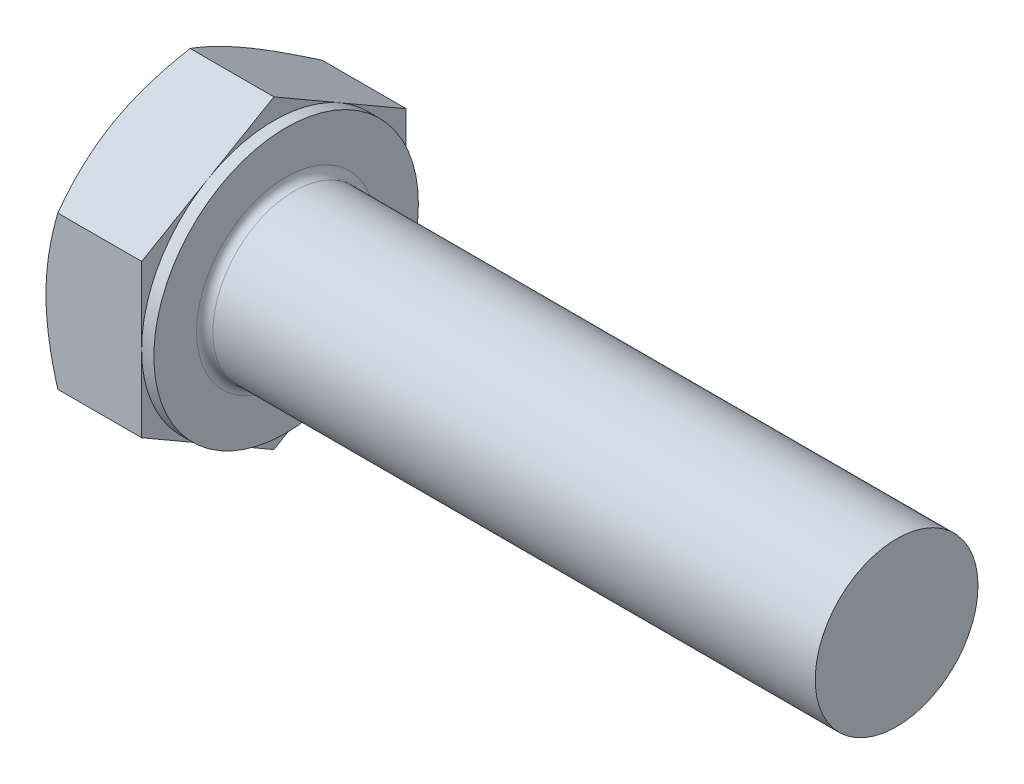
ISO-10303-21;
HEADER;
FILE_DESCRIPTION(('STEP AP214'),'2;1');
FILE_NAME('part.step','',(''),(''),'','','');
FILE_SCHEMA(('AUTOMOTIVE_DESIGN { 1 0 10303 214 1 1 1 1 }'));
ENDSEC;
DATA;
#1=APPLICATION_CONTEXT('core data for automotive mechanical design processes');
#2=APPLICATION_PROTOCOL_DEFINITION('international standard','automotive_design',2000,#1);
#3=PRODUCT_CONTEXT('',#1,'mechanical');
#4=PRODUCT('Part','Part','',(#3));
#5=PRODUCT_RELATED_PRODUCT_CATEGORY('part','',(#4));
#6=PRODUCT_DEFINITION_FORMATION('','',#4);
#7=PRODUCT_DEFINITION_CONTEXT('part definition',#1,'design');
#8=PRODUCT_DEFINITION('design','',#6,#7);
#9=PRODUCT_DEFINITION_SHAPE('','',#8);
#10=(LENGTH_UNIT() NAMED_UNIT(*) SI_UNIT(.MILLI.,.METRE.));
#11=(NAMED_UNIT(*) PLANE_ANGLE_UNIT() SI_UNIT($,.RADIAN.));
#12=(NAMED_UNIT(*) SI_UNIT($,.STERADIAN.) SOLID_ANGLE_UNIT());
#13=UNCERTAINTY_MEASURE_WITH_UNIT(LENGTH_MEASURE(1.E-05),#10,'distance_accuracy_value','');
#14=(GEOMETRIC_REPRESENTATION_CONTEXT(3) GLOBAL_UNCERTAINTY_ASSIGNED_CONTEXT((#13)) GLOBAL_UNIT_ASSIGNED_CONTEXT((#10,
#11,#12)) REPRESENTATION_CONTEXT('',''));
#15=CARTESIAN_POINT('',(0.,0.,0.));
#16=DIRECTION('',(0.,0.,1.));
#17=DIRECTION('',(1.,0.,0.));
#18=AXIS2_PLACEMENT_3D('',#15,#16,#17);
#19=CARTESIAN_POINT('',(0.,0.,0.));
#20=DIRECTION('',(-1.,0.,0.));
#21=DIRECTION('',(0.,0.,1.));
#22=AXIS2_PLACEMENT_3D('',#19,#20,#21);
#23=CYLINDRICAL_SURFACE('',#22,4.);
#24=CARTESIAN_POINT('',(5.7,0.,0.));
#25=DIRECTION('',(1.,0.,0.));
#26=DIRECTION('',(0.,0.,-1.));
#27=AXIS2_PLACEMENT_3D('',#24,#25,#26);
#28=CIRCLE('',#27,4.);
#29=CARTESIAN_POINT('',(5.7,0.,-4.));
#30=VERTEX_POINT('',#29);
#31=EDGE_CURVE('E12',#30,#30,#28,.T.);
#32=ORIENTED_EDGE('',*,*,#31,.T.);
#33=EDGE_LOOP('',(#32));
#34=FACE_BOUND('',#33,.T.);
#35=CARTESIAN_POINT('',(35.3,0.,0.));
#36=DIRECTION('',(1.,0.,0.));
#37=DIRECTION('',(0.,0.,-1.));
#38=AXIS2_PLACEMENT_3D('',#35,#36,#37);
#39=CIRCLE('',#38,4.);
#40=CARTESIAN_POINT('',(35.3,0.,-4.));
#41=VERTEX_POINT('',#40);
#42=EDGE_CURVE('E46',#41,#41,#39,.T.);
#43=ORIENTED_EDGE('',*,*,#42,.F.);
#44=EDGE_LOOP('',(#43));
#45=FACE_BOUND('',#44,.T.);
#46=ADVANCED_FACE('F42',(#34,#45),#23,.T.);
#47=CARTESIAN_POINT('',(5.3,3.75277674973256,-6.5));
#48=DIRECTION('',(0.,-0.866025403784438,0.500000000000001));
#49=DIRECTION('',(0.,-0.500000000000001,-0.866025403784438));
#50=AXIS2_PLACEMENT_3D('',#47,#48,#49);
#51=PLANE('',#50);
#52=DIRECTION('',(0.,0.500000000000001,0.866025403784438));
#53=VECTOR('',#52,1.);
#54=CARTESIAN_POINT('',(4.7,3.75277674973256,-6.5));
#55=LINE('',#54,#53);
#56=CARTESIAN_POINT('',(4.7,3.75277674973256,-6.5));
#57=VERTEX_POINT('',#56);
#58=CARTESIAN_POINT('',(4.7,5.62916512459885,-3.25000000000001));
#59=VERTEX_POINT('',#58);
#60=EDGE_CURVE('E175',#57,#59,#55,.T.);
#61=ORIENTED_EDGE('',*,*,#60,.F.);
#62=DIRECTION('',(-1.,0.,0.));
#63=VECTOR('',#62,1.);
#64=CARTESIAN_POINT('',(5.3,3.75277674973256,-6.5));
#65=LINE('',#64,#63);
#66=CARTESIAN_POINT('',(0.580556583600761,3.75277674973256,-6.5));
#67=VERTEX_POINT('',#66);
#68=EDGE_CURVE('E263',#57,#67,#65,.T.);
#69=ORIENTED_EDGE('',*,*,#68,.T.);
#70=CARTESIAN_POINT('',(0.580623251805869,7.50566896951898,0.000200000000000029));
#71=CARTESIAN_POINT('',(0.533004423075488,7.4231786300702,-0.14267745905888));
#72=CARTESIAN_POINT('',(0.487546700602709,7.34038072665458,-0.286087634534912));
#73=CARTESIAN_POINT('',(0.401548682023048,7.17411251123976,-0.574072631317194));
#74=CARTESIAN_POINT('',(0.361010507228027,7.09064192560665,-0.718647926571263));
#75=CARTESIAN_POINT('',(0.24757100112321,6.83889369625719,-1.15468865052003));
#76=CARTESIAN_POINT('',(0.183047807128741,6.66962231516081,-1.44787528284632));
#77=CARTESIAN_POINT('',(0.107386583547493,6.41631077211555,-1.88662374554437));
#78=CARTESIAN_POINT('',(0.0858328564569888,6.33302748139454,-2.03087463649469));
#79=CARTESIAN_POINT('',(0.04969031460612,6.16608458377293,-2.32002821713809));
#80=CARTESIAN_POINT('',(0.0351008844596674,6.08242501078143,-2.46493084809889));
#81=CARTESIAN_POINT('',(0.0132587525073473,5.91496056339806,-2.75498777942832));
#82=CARTESIAN_POINT('',(0.0059977243221082,5.8311559625217,-2.90014160605421));
#83=CARTESIAN_POINT('',(-0.00103969741776845,5.66347396979287,-3.19057533697495));
#84=CARTESIAN_POINT('',(-0.000816322187795277,5.5795965802691,-3.33585523723636));
#85=CARTESIAN_POINT('',(0.010083458515165,5.34979921898453,-3.73387594242649));
#86=CARTESIAN_POINT('',(0.0283818178694127,5.20395446807007,-3.98648646102757));
#87=CARTESIAN_POINT('',(0.0864063414576742,4.91323365606635,-4.49002967823568));
#88=CARTESIAN_POINT('',(0.126152338538244,4.76835861741226,-4.74096060593308));
#89=CARTESIAN_POINT('',(0.225505903202148,4.47705272008731,-5.24551722064432));
#90=CARTESIAN_POINT('',(0.285534425638025,4.33065861912702,-5.49907924143591));
#91=CARTESIAN_POINT('',(0.421774992509866,4.04005357906493,-6.00242193575904));
#92=CARTESIAN_POINT('',(0.49795503416359,3.89583891821181,-6.25220905555296));
#93=CARTESIAN_POINT('',(0.580623251805865,3.75266127967872,-6.5002));
#94=B_SPLINE_CURVE_WITH_KNOTS('',3,(#70,#71,#72,#73,#74,#75,#76,#77,#78,#79,#80,#81,#82,#83,#84,
#85,#86,#87,#88,#89,#90,#91,#92,#93),.UNSPECIFIED.,.F.,.F.,(4,2,2,2,2,2,2,2,2,2,2,4),(0.,
0.515105052395587,1.03043143507524,2.06322554824262,2.56697389547996,3.07067772176454,
3.57380860368928,4.0769239424252,4.9527935470566,5.82947446853467,6.72559912449736,
7.61996451221046),.UNSPECIFIED.);
#95=CARTESIAN_POINT('',(0.,5.62916512459885,-3.25000000000001));
#96=VERTEX_POINT('',#95);
#97=EDGE_CURVE('E230',#96,#67,#94,.T.);
#98=ORIENTED_EDGE('',*,*,#97,.F.);
#99=CARTESIAN_POINT('',(0.580556583600765,7.50555349946514,0.));
#100=VERTEX_POINT('',#99);
#101=EDGE_CURVE('E66',#100,#96,#94,.T.);
#102=ORIENTED_EDGE('',*,*,#101,.F.);
#103=DIRECTION('',(-1.,0.,0.));
#104=VECTOR('',#103,1.);
#105=CARTESIAN_POINT('',(5.3,7.50555349946514,0.));
#106=LINE('',#105,#104);
#107=CARTESIAN_POINT('',(4.7,7.50555349946514,0.));
#108=VERTEX_POINT('',#107);
#109=EDGE_CURVE('E281',#108,#100,#106,.T.);
#110=ORIENTED_EDGE('',*,*,#109,.F.);
#111=EDGE_CURVE('E173',#59,#108,#55,.T.);
#112=ORIENTED_EDGE('',*,*,#111,.F.);
#113=EDGE_LOOP('',(#61,#69,#98,#102,#110,#112));
#114=FACE_BOUND('',#113,.T.);
#115=ADVANCED_FACE('F250',(#114),#51,.F.);
#116=CARTESIAN_POINT('',(5.3,7.50555349946514,0.));
#117=DIRECTION('',(0.,-0.866025403784438,-0.500000000000001));
#118=DIRECTION('',(0.,0.500000000000001,-0.866025403784438));
#119=AXIS2_PLACEMENT_3D('',#116,#117,#118);
#120=PLANE('',#119);
#121=DIRECTION('',(0.,-0.500000000000001,0.866025403784438));
#122=VECTOR('',#121,1.);
#123=CARTESIAN_POINT('',(4.7,7.50555349946514,0.));
#124=LINE('',#123,#122);
#125=CARTESIAN_POINT('',(4.7,5.62916512459885,3.25000000000001));
#126=VERTEX_POINT('',#125);
#127=EDGE_CURVE('E172',#108,#126,#124,.T.);
#128=ORIENTED_EDGE('',*,*,#127,.F.);
#129=ORIENTED_EDGE('',*,*,#109,.T.);
#130=CARTESIAN_POINT('',(0.580623251805864,3.75266127967873,6.50019999999999));
#131=CARTESIAN_POINT('',(0.533004423075483,3.83515161912751,6.35732254094111));
#132=CARTESIAN_POINT('',(0.487546700602704,3.91794952254312,6.21391236546508));
#133=CARTESIAN_POINT('',(0.401548682023044,4.08421773795795,5.9259273686828));
#134=CARTESIAN_POINT('',(0.361010507228023,4.16768832359106,5.78135207342873));
#135=CARTESIAN_POINT('',(0.247571001123206,4.41943655294052,5.34531134947996));
#136=CARTESIAN_POINT('',(0.183047807128738,4.5887079340369,5.05212471715368));
#137=CARTESIAN_POINT('',(0.107386583547491,4.84201947708215,4.61337625445562));
#138=CARTESIAN_POINT('',(0.0858328564569875,4.92530276780316,4.4691253635053));
#139=CARTESIAN_POINT('',(0.0496903146061193,5.09224566542477,4.17997178286191));
#140=CARTESIAN_POINT('',(0.035100884459667,5.17590523841628,4.03506915190111));
#141=CARTESIAN_POINT('',(0.0132587525073475,5.34336968579964,3.74501222057168));
#142=CARTESIAN_POINT('',(0.00599772432210867,5.427174286676,3.59985839394579));
#143=CARTESIAN_POINT('',(-0.00103969741776742,5.59485627940484,3.30942466302505));
#144=CARTESIAN_POINT('',(-0.000816322187794007,5.67873366892861,3.16414476276364));
#145=CARTESIAN_POINT('',(0.0100834585151669,5.90853103021318,2.7661240575735));
#146=CARTESIAN_POINT('',(0.0283818178694149,6.05437578112764,2.51351353897243));
#147=CARTESIAN_POINT('',(0.0864063414576771,6.34509659313135,2.00997032176432));
#148=CARTESIAN_POINT('',(0.126152338538247,6.48997163178545,1.75903939406691));
#149=CARTESIAN_POINT('',(0.225505903202152,6.78127752911039,1.25448277935568));
#150=CARTESIAN_POINT('',(0.285534425638029,6.92767163007068,1.00092075856408));
#151=CARTESIAN_POINT('',(0.421774992509871,7.21827667013277,0.497578064240953));
#152=CARTESIAN_POINT('',(0.497955034163595,7.36249133098589,0.247790944447035));
#153=CARTESIAN_POINT('',(0.58062325180587,7.50566896951898,-0.000200000000001186));
#154=B_SPLINE_CURVE_WITH_KNOTS('',3,(#130,#131,#132,#133,#134,#135,#136,#137,#138,#139,#140,
#141,#142,#143,#144,#145,#146,#147,#148,#149,#150,#151,#152,#153),.UNSPECIFIED.,.F.,.F.,(4,2,2,
2,2,2,2,2,2,2,2,4),(0.,0.515105052395587,1.03043143507524,2.06322554824262,2.56697389547996,
3.07067772176453,3.57380860368928,4.0769239424252,4.9527935470566,5.82947446853466,
6.72559912449736,7.61996451221045),.UNSPECIFIED.);
#155=CARTESIAN_POINT('',(0.,5.62916512459885,3.25));
#156=VERTEX_POINT('',#155);
#157=EDGE_CURVE('E227',#156,#100,#154,.T.);
#158=ORIENTED_EDGE('',*,*,#157,.F.);
#159=CARTESIAN_POINT('',(0.58055658360076,3.75277674973257,6.49999999999999));
#160=VERTEX_POINT('',#159);
#161=EDGE_CURVE('E240',#160,#156,#154,.T.);
#162=ORIENTED_EDGE('',*,*,#161,.F.);
#163=DIRECTION('',(-1.,0.,0.));
#164=VECTOR('',#163,1.);
#165=CARTESIAN_POINT('',(5.3,3.75277674973257,6.49999999999999));
#166=LINE('',#165,#164);
#167=CARTESIAN_POINT('',(4.7,3.75277674973257,6.49999999999999));
#168=VERTEX_POINT('',#167);
#169=EDGE_CURVE('E279',#168,#160,#166,.T.);
#170=ORIENTED_EDGE('',*,*,#169,.F.);
#171=EDGE_CURVE('E140',#126,#168,#124,.T.);
#172=ORIENTED_EDGE('',*,*,#171,.F.);
#173=EDGE_LOOP('',(#128,#129,#158,#162,#170,#172));
#174=FACE_BOUND('',#173,.T.);
#175=ADVANCED_FACE('F247',(#174),#120,.F.);
#176=CARTESIAN_POINT('',(5.3,3.75277674973257,6.49999999999999));
#177=DIRECTION('',(0.,0.,-1.));
#178=DIRECTION('',(0.,1.,0.));
#179=AXIS2_PLACEMENT_3D('',#176,#177,#178);
#180=PLANE('',#179);
#181=DIRECTION('',(0.,-1.,0.));
#182=VECTOR('',#181,1.);
#183=CARTESIAN_POINT('',(4.7,3.75277674973257,6.49999999999999));
#184=LINE('',#183,#182);
#185=CARTESIAN_POINT('',(4.7,0.,6.5));
#186=VERTEX_POINT('',#185);
#187=EDGE_CURVE('E134',#168,#186,#184,.T.);
#188=ORIENTED_EDGE('',*,*,#187,.F.);
#189=ORIENTED_EDGE('',*,*,#169,.T.);
#190=CARTESIAN_POINT('',(3.18835311590244,-10.1137456678934,6.5));
#191=CARTESIAN_POINT('',(3.05034774010467,-9.82952666322135,6.5));
#192=CARTESIAN_POINT('',(2.91365616489937,-9.54465869649271,6.5));
#193=CARTESIAN_POINT('',(2.6436389949754,-8.97327978057919,6.5));
#194=CARTESIAN_POINT('',(2.51031392459095,-8.6867685838847,6.5));
#195=CARTESIAN_POINT('',(2.24710473482718,-8.11029837842687,6.5));
#196=CARTESIAN_POINT('',(2.11724300438679,-7.82032911201509,6.5));
#197=CARTESIAN_POINT('',(1.86279082826902,-7.23809541022337,6.5));
#198=CARTESIAN_POINT('',(1.73820013554673,-6.94583108317205,6.5));
#199=CARTESIAN_POINT('',(1.4917668542696,-6.34906440963034,6.5));
#200=CARTESIAN_POINT('',(1.37014257641264,-6.0444714228887,6.5));
#201=CARTESIAN_POINT('',(1.13601865758148,-5.43173420957313,6.5));
#202=CARTESIAN_POINT('',(1.02352003558021,-5.12358959079844,6.5));
#203=CARTESIAN_POINT('',(0.81057536823991,-4.50382569782258,6.5));
#204=CARTESIAN_POINT('',(0.710105232301999,-4.19221478266991,6.5));
#205=CARTESIAN_POINT('',(0.524420166144448,-3.5645201920601,6.5));
#206=CARTESIAN_POINT('',(0.439200468206412,-3.24843794792919,6.5));
#207=CARTESIAN_POINT('',(0.288524223401192,-2.61335465712781,6.5));
#208=CARTESIAN_POINT('',(0.222961865744744,-2.29437912059503,6.5));
#209=CARTESIAN_POINT('',(0.115312883130721,-1.65238219405861,6.5));
#210=CARTESIAN_POINT('',(0.07322390146906,-1.32936121354428,6.5));
#211=CARTESIAN_POINT('',(0.0304887136381633,-0.845231171839968,6.5));
#212=CARTESIAN_POINT('',(0.0196493434273812,-0.684982209663085,6.5));
#213=CARTESIAN_POINT('',(0.00475298486143764,-0.364162349065443,6.5));
#214=CARTESIAN_POINT('',(0.000695882908830497,-0.203591456081862,6.5));
#215=CARTESIAN_POINT('',(-0.000531597190095941,0.117577430374314,6.5));
#216=CARTESIAN_POINT('',(0.002298090170126,0.278175424090159,6.5));
#217=CARTESIAN_POINT('',(0.0147726845547631,0.599108972823522,6.5));
#218=CARTESIAN_POINT('',(0.0244179260500512,0.759444514574234,6.5));
#219=CARTESIAN_POINT('',(0.0554961939342999,1.14369946602535,6.5));
#220=CARTESIAN_POINT('',(0.080103049051452,1.36736763045088,6.49999999999999));
#221=CARTESIAN_POINT('',(0.141246537453378,1.81305591311689,6.49999999999999));
#222=CARTESIAN_POINT('',(0.177784759614453,2.0350758078311,6.49999999999999));
#223=CARTESIAN_POINT('',(0.303360001332117,2.69839633433797,6.49999999999999));
#224=CARTESIAN_POINT('',(0.408335815147597,3.13672010374359,6.49999999999999));
#225=CARTESIAN_POINT('',(0.590564593134944,3.7923211291812,6.49999999999999));
#226=CARTESIAN_POINT('',(0.656313198979096,4.01299150874075,6.49999999999999));
#227=CARTESIAN_POINT('',(0.794681634200737,4.45218859008393,6.49999999999999));
#228=CARTESIAN_POINT('',(0.867301513122622,4.67071527639821,6.49999999999999));
#229=CARTESIAN_POINT('',(1.01824353854295,5.10569490252728,6.49999999999999));
#230=CARTESIAN_POINT('',(1.09656388232839,5.32214847365078,6.49999999999999));
#231=CARTESIAN_POINT('',(1.25798086164822,5.75325725773041,6.49999999999999));
#232=CARTESIAN_POINT('',(1.34107741035996,5.96791250329558,6.49999999999999));
#233=CARTESIAN_POINT('',(1.56029019583042,6.51888445936375,6.49999999999999));
#234=CARTESIAN_POINT('',(1.69936356666535,6.85402316813629,6.49999999999999));
#235=CARTESIAN_POINT('',(1.98501958087353,7.52109583939395,6.49999999999999));
#236=CARTESIAN_POINT('',(2.13160288780792,7.85302951559935,6.49999999999999));
#237=CARTESIAN_POINT('',(2.43059748044952,8.51437865518659,6.49999999999999));
#238=CARTESIAN_POINT('',(2.5830105759696,8.84379329784095,6.49999999999999));
#239=CARTESIAN_POINT('',(2.89234869374927,9.50047798683786,6.49999999999999));
#240=CARTESIAN_POINT('',(3.04927357220059,9.82774810112758,6.49999999999999));
#241=CARTESIAN_POINT('',(3.36692013130637,10.4809971975748,6.49999999999999));
#242=CARTESIAN_POINT('',(3.52764676491733,10.8069737667408,6.49999999999999));
#243=CARTESIAN_POINT('',(3.851985555549,11.4574882901034,6.49999999999999));
#244=CARTESIAN_POINT('',(4.01559773123066,11.7820262349792,6.49999999999999));
#245=CARTESIAN_POINT('',(4.50986185003773,12.7537468114441,6.49999999999999));
#246=CARTESIAN_POINT('',(4.84399997978541,13.3991555932469,6.49999999999999));
#247=CARTESIAN_POINT('',(5.48575990265919,14.6239779290894,6.49999999999999));
#248=CARTESIAN_POINT('',(5.79279643372279,15.2036995760604,6.49999999999999));
#249=CARTESIAN_POINT('',(6.4106918822763,16.3611382637875,6.49999999999999));
#250=CARTESIAN_POINT('',(6.72155099010109,16.938855202873,6.49999999999999));
#251=CARTESIAN_POINT('',(7.34519775439014,18.0910273555999,6.49999999999999));
#252=CARTESIAN_POINT('',(7.65797694168864,18.665487160613,6.49999999999999));
#253=CARTESIAN_POINT('',(8.28574397153078,19.8131486204439,6.49999999999999));
#254=CARTESIAN_POINT('',(8.60073166294279,20.3863503578957,6.49999999999999));
#255=CARTESIAN_POINT('',(8.91652967168741,20.9591024521449,6.49999999999999));
#256=B_SPLINE_CURVE_WITH_KNOTS('',3,(#190,#191,#192,#193,#194,#195,#196,#197,#198,#199,#200,
#201,#202,#203,#204,#205,#206,#207,#208,#209,#210,#211,#212,#213,#214,#215,#216,#217,#218,#219,
#220,#221,#222,#223,#224,#225,#226,#227,#228,#229,#230,#231,#232,#233,#234,#235,#236,#237,#238,
#239,#240,#241,#242,#243,#244,#245,#246,#247,#248,#249,#250,#251,#252,#253,#254,#255),
.UNSPECIFIED.,.F.,.F.,(4,2,2,2,2,2,2,2,2,2,2,2,2,2,2,2,2,2,2,2,2,2,2,2,2,2,2,2,2,2,2,2,4),(0.,
0.947868666702312,1.89588406483492,2.84900320930536,3.80207763304314,4.7858977408271,
5.76982755141751,6.75175256246684,7.73337005764393,8.7096047489099,9.68574140951123,
10.1674651053568,10.6491807326436,11.1309009419855,11.6126447932157,12.287317572382,
12.9620802330383,14.3123184380929,15.0030310344276,15.6937486114326,16.384248697357,
17.0747362352244,18.1631508683747,19.2516618378193,20.3405135142583,21.4293305231019,
22.5196540547636,23.6099846401957,25.7902468235016,27.7582608872417,29.7263733429304,
31.6886408595598,33.6507753806319),.UNSPECIFIED.);
#257=CARTESIAN_POINT('',(0.,0.,6.5));
#258=VERTEX_POINT('',#257);
#259=EDGE_CURVE('E241',#258,#160,#256,.T.);
#260=ORIENTED_EDGE('',*,*,#259,.F.);
#261=CARTESIAN_POINT('',(0.580556583600758,-3.75277674973255,6.5));
#262=VERTEX_POINT('',#261);
#263=EDGE_CURVE('E273',#262,#258,#256,.T.);
#264=ORIENTED_EDGE('',*,*,#263,.F.);
#265=DIRECTION('',(-1.,0.,0.));
#266=VECTOR('',#265,1.);
#267=CARTESIAN_POINT('',(5.3,-3.75277674973255,6.5));
#268=LINE('',#267,#266);
#269=CARTESIAN_POINT('',(4.7,-3.75277674973255,6.5));
#270=VERTEX_POINT('',#269);
#271=EDGE_CURVE('E166',#270,#262,#268,.T.);
#272=ORIENTED_EDGE('',*,*,#271,.F.);
#273=EDGE_CURVE('E144',#186,#270,#184,.T.);
#274=ORIENTED_EDGE('',*,*,#273,.F.);
#275=EDGE_LOOP('',(#188,#189,#260,#264,#272,#274));
#276=FACE_BOUND('',#275,.T.);
#277=ADVANCED_FACE('F164',(#276),#180,.F.);
#278=CARTESIAN_POINT('',(5.3,-7.50555349946513,0.));
#279=DIRECTION('',(0.,0.866025403784438,-0.500000000000001));
#280=DIRECTION('',(0.,0.500000000000001,0.866025403784438));
#281=AXIS2_PLACEMENT_3D('',#278,#279,#280);
#282=PLANE('',#281);
#283=DIRECTION('',(0.,-0.500000000000001,-0.866025403784438));
#284=VECTOR('',#283,1.);
#285=CARTESIAN_POINT('',(4.7,-7.50555349946513,0.));
#286=LINE('',#285,#284);
#287=CARTESIAN_POINT('',(4.7,-5.62916512459885,3.25000000000001));
#288=VERTEX_POINT('',#287);
#289=EDGE_CURVE('E151',#270,#288,#286,.T.);
#290=ORIENTED_EDGE('',*,*,#289,.F.);
#291=ORIENTED_EDGE('',*,*,#271,.T.);
#292=CARTESIAN_POINT('',(0.580623251805864,-7.50566896951897,-0.000199999999999516));
#293=CARTESIAN_POINT('',(0.533004423075482,-7.42317863007019,0.142677459058881));
#294=CARTESIAN_POINT('',(0.487546700602703,-7.34038072665457,0.286087634534913));
#295=CARTESIAN_POINT('',(0.401548682023043,-7.17411251123975,0.574072631317194));
#296=CARTESIAN_POINT('',(0.361010507228022,-7.09064192560664,0.718647926571264));
#297=CARTESIAN_POINT('',(0.247571001123205,-6.83889369625718,1.15468865052003));
#298=CARTESIAN_POINT('',(0.183047807128736,-6.6696223151608,1.44787528284632));
#299=CARTESIAN_POINT('',(0.107386583547488,-6.41631077211554,1.88662374554437));
#300=CARTESIAN_POINT('',(0.0858328564569831,-6.33302748139453,2.03087463649469));
#301=CARTESIAN_POINT('',(0.0496903146061144,-6.16608458377292,2.32002821713809));
#302=CARTESIAN_POINT('',(0.0351008844596622,-6.08242501078142,2.46493084809889));
#303=CARTESIAN_POINT('',(0.0132587525073423,-5.91496056339806,2.75498777942832));
#304=CARTESIAN_POINT('',(0.0059977243221031,-5.83115596252169,2.90014160605421));
#305=CARTESIAN_POINT('',(-0.0010396974177736,-5.66347396979286,3.19057533697494));
#306=CARTESIAN_POINT('',(-0.000816322187800414,-5.57959658026909,3.33585523723635));
#307=CARTESIAN_POINT('',(0.0100834585151599,-5.34979921898452,3.73387594242649));
#308=CARTESIAN_POINT('',(0.0283818178694076,-5.20395446807006,3.98648646102757));
#309=CARTESIAN_POINT('',(0.0864063414576692,-4.91323365606635,4.49002967823567));
#310=CARTESIAN_POINT('',(0.126152338538239,-4.76835861741225,4.74096060593308));
#311=CARTESIAN_POINT('',(0.225505903202144,-4.4770527200873,5.24551722064432));
#312=CARTESIAN_POINT('',(0.285534425638021,-4.33065861912701,5.49907924143591));
#313=CARTESIAN_POINT('',(0.421774992509863,-4.04005357906492,6.00242193575904));
#314=CARTESIAN_POINT('',(0.497955034163587,-3.8958389182118,6.25220905555296));
#315=CARTESIAN_POINT('',(0.580623251805862,-3.75266127967871,6.5002));
#316=B_SPLINE_CURVE_WITH_KNOTS('',3,(#292,#293,#294,#295,#296,#297,#298,#299,#300,#301,#302,
#303,#304,#305,#306,#307,#308,#309,#310,#311,#312,#313,#314,#315),.UNSPECIFIED.,.F.,.F.,(4,2,2,
2,2,2,2,2,2,2,2,4),(0.,0.515105052395587,1.03043143507524,2.06322554824262,2.56697389547996,
3.07067772176453,3.57380860368927,4.0769239424252,4.9527935470566,5.82947446853466,
6.72559912449736,7.61996451221046),.UNSPECIFIED.);
#317=CARTESIAN_POINT('',(0.,-5.62916512459885,3.25000000000001));
#318=VERTEX_POINT('',#317);
#319=EDGE_CURVE('E229',#318,#262,#316,.T.);
#320=ORIENTED_EDGE('',*,*,#319,.F.);
#321=CARTESIAN_POINT('',(0.580556583600759,-7.50555349946513,0.));
#322=VERTEX_POINT('',#321);
#323=EDGE_CURVE('E221',#322,#318,#316,.T.);
#324=ORIENTED_EDGE('',*,*,#323,.F.);
#325=DIRECTION('',(-1.,0.,0.));
#326=VECTOR('',#325,1.);
#327=CARTESIAN_POINT('',(5.3,-7.50555349946513,0.));
#328=LINE('',#327,#326);
#329=CARTESIAN_POINT('',(4.7,-7.50555349946513,0.));
#330=VERTEX_POINT('',#329);
#331=EDGE_CURVE('E274',#330,#322,#328,.T.);
#332=ORIENTED_EDGE('',*,*,#331,.F.);
#333=EDGE_CURVE('E167',#288,#330,#286,.T.);
#334=ORIENTED_EDGE('',*,*,#333,.F.);
#335=EDGE_LOOP('',(#290,#291,#320,#324,#332,#334));
#336=FACE_BOUND('',#335,.T.);
#337=ADVANCED_FACE('F212',(#336),#282,.F.);
#338=CARTESIAN_POINT('',(5.3,-3.75277674973257,-6.5));
#339=DIRECTION('',(0.,0.866025403784439,0.499999999999999));
#340=DIRECTION('',(0.,-0.499999999999999,0.866025403784439));
#341=AXIS2_PLACEMENT_3D('',#338,#339,#340);
#342=PLANE('',#341);
#343=DIRECTION('',(0.,0.499999999999999,-0.866025403784439));
#344=VECTOR('',#343,1.);
#345=CARTESIAN_POINT('',(4.7,-3.75277674973257,-6.5));
#346=LINE('',#345,#344);
#347=CARTESIAN_POINT('',(4.7,-5.62916512459885,-3.25));
#348=VERTEX_POINT('',#347);
#349=EDGE_CURVE('E520',#330,#348,#346,.T.);
#350=ORIENTED_EDGE('',*,*,#349,.F.);
#351=ORIENTED_EDGE('',*,*,#331,.T.);
#352=CARTESIAN_POINT('',(0.580623251805868,-3.75266127967873,-6.5002));
#353=CARTESIAN_POINT('',(0.533004423075486,-3.8351516191275,-6.35732254094112));
#354=CARTESIAN_POINT('',(0.487546700602707,-3.91794952254312,-6.21391236546509));
#355=CARTESIAN_POINT('',(0.401548682023047,-4.08421773795795,-5.92592736868281));
#356=CARTESIAN_POINT('',(0.361010507228026,-4.16768832359105,-5.78135207342874));
#357=CARTESIAN_POINT('',(0.247571001123209,-4.41943655294051,-5.34531134947997));
#358=CARTESIAN_POINT('',(0.183047807128739,-4.5887079340369,-5.05212471715368));
#359=CARTESIAN_POINT('',(0.107386583547491,-4.84201947708215,-4.61337625445563));
#360=CARTESIAN_POINT('',(0.0858328564569875,-4.92530276780316,-4.46912536350531));
#361=CARTESIAN_POINT('',(0.0496903146061189,-5.09224566542477,-4.17997178286191));
#362=CARTESIAN_POINT('',(0.0351008844596664,-5.17590523841627,-4.03506915190111));
#363=CARTESIAN_POINT('',(0.0132587525073464,-5.34336968579964,-3.74501222057168));
#364=CARTESIAN_POINT('',(0.00599772432210742,-5.427174286676,-3.59985839394579));
#365=CARTESIAN_POINT('',(-0.00103969741776892,-5.59485627940483,-3.30942466302505));
#366=CARTESIAN_POINT('',(-0.000816322187795567,-5.6787336689286,-3.16414476276364));
#367=CARTESIAN_POINT('',(0.0100834585151648,-5.90853103021317,-2.7661240575735));
#368=CARTESIAN_POINT('',(0.0283818178694121,-6.05437578112763,-2.51351353897243));
#369=CARTESIAN_POINT('',(0.0864063414576732,-6.34509659313134,-2.00997032176432));
#370=CARTESIAN_POINT('',(0.126152338538243,-6.48997163178544,-1.75903939406692));
#371=CARTESIAN_POINT('',(0.225505903202147,-6.78127752911038,-1.25448277935568));
#372=CARTESIAN_POINT('',(0.285534425638024,-6.92767163007067,-1.00092075856408));
#373=CARTESIAN_POINT('',(0.421774992509865,-7.21827667013276,-0.497578064240954));
#374=CARTESIAN_POINT('',(0.49795503416359,-7.36249133098588,-0.247790944447035));
#375=CARTESIAN_POINT('',(0.580623251805864,-7.50566896951897,0.00020000000000041));
#376=B_SPLINE_CURVE_WITH_KNOTS('',3,(#352,#353,#354,#355,#356,#357,#358,#359,#360,#361,#362,
#363,#364,#365,#366,#367,#368,#369,#370,#371,#372,#373,#374,#375),.UNSPECIFIED.,.F.,.F.,(4,2,2,
2,2,2,2,2,2,2,2,4),(0.,0.515105052395587,1.03043143507524,2.06322554824262,2.56697389547996,
3.07067772176454,3.57380860368928,4.0769239424252,4.9527935470566,5.82947446853466,
6.72559912449736,7.61996451221045),.UNSPECIFIED.);
#377=CARTESIAN_POINT('',(0.,-5.62916512459885,-3.24999999999999));
#378=VERTEX_POINT('',#377);
#379=EDGE_CURVE('E228',#378,#322,#376,.T.);
#380=ORIENTED_EDGE('',*,*,#379,.F.);
#381=CARTESIAN_POINT('',(0.580556583600764,-3.75277674973257,-6.5));
#382=VERTEX_POINT('',#381);
#383=EDGE_CURVE('E189',#382,#378,#376,.T.);
#384=ORIENTED_EDGE('',*,*,#383,.F.);
#385=DIRECTION('',(-1.,0.,0.));
#386=VECTOR('',#385,1.);
#387=CARTESIAN_POINT('',(5.3,-3.75277674973257,-6.5));
#388=LINE('',#387,#386);
#389=CARTESIAN_POINT('',(4.7,-3.75277674973257,-6.5));
#390=VERTEX_POINT('',#389);
#391=EDGE_CURVE('E272',#390,#382,#388,.T.);
#392=ORIENTED_EDGE('',*,*,#391,.F.);
#393=EDGE_CURVE('E162',#348,#390,#346,.T.);
#394=ORIENTED_EDGE('',*,*,#393,.F.);
#395=EDGE_LOOP('',(#350,#351,#380,#384,#392,#394));
#396=FACE_BOUND('',#395,.T.);
#397=ADVANCED_FACE('F205',(#396),#342,.F.);
#398=CARTESIAN_POINT('',(5.3,3.75277674973256,-6.5));
#399=DIRECTION('',(0.,0.,1.));
#400=DIRECTION('',(0.,-1.,0.));
#401=AXIS2_PLACEMENT_3D('',#398,#399,#400);
#402=PLANE('',#401);
#403=DIRECTION('',(0.,1.,0.));
#404=VECTOR('',#403,1.);
#405=CARTESIAN_POINT('',(4.7,3.75277674973256,-6.5));
#406=LINE('',#405,#404);
#407=CARTESIAN_POINT('',(4.7,0.,-6.5));
#408=VERTEX_POINT('',#407);
#409=EDGE_CURVE('E292',#390,#408,#406,.T.);
#410=ORIENTED_EDGE('',*,*,#409,.F.);
#411=ORIENTED_EDGE('',*,*,#391,.T.);
#412=CARTESIAN_POINT('',(3.18835311590245,-10.1137456678934,-6.5));
#413=CARTESIAN_POINT('',(3.05034774010468,-9.82952666322137,-6.5));
#414=CARTESIAN_POINT('',(2.91365616489938,-9.54465869649273,-6.5));
#415=CARTESIAN_POINT('',(2.64363899497541,-8.97327978057921,-6.5));
#416=CARTESIAN_POINT('',(2.51031392459096,-8.68676858388471,-6.5));
#417=CARTESIAN_POINT('',(2.24710473482719,-8.11029837842688,-6.5));
#418=CARTESIAN_POINT('',(2.1172430043868,-7.82032911201511,-6.5));
#419=CARTESIAN_POINT('',(1.86279082826903,-7.23809541022339,-6.5));
#420=CARTESIAN_POINT('',(1.73820013554674,-6.94583108317206,-6.5));
#421=CARTESIAN_POINT('',(1.49176685426961,-6.34906440963035,-6.5));
#422=CARTESIAN_POINT('',(1.37014257641265,-6.04447142288871,-6.5));
#423=CARTESIAN_POINT('',(1.13601865758149,-5.43173420957315,-6.5));
#424=CARTESIAN_POINT('',(1.02352003558022,-5.12358959079845,-6.5));
#425=CARTESIAN_POINT('',(0.810575368239917,-4.50382569782259,-6.5));
#426=CARTESIAN_POINT('',(0.710105232302004,-4.19221478266992,-6.5));
#427=CARTESIAN_POINT('',(0.524420166144453,-3.56452019206011,-6.5));
#428=CARTESIAN_POINT('',(0.439200468206417,-3.2484379479292,-6.5));
#429=CARTESIAN_POINT('',(0.288524223401197,-2.61335465712782,-6.5));
#430=CARTESIAN_POINT('',(0.222961865744749,-2.29437912059504,-6.5));
#431=CARTESIAN_POINT('',(0.115312883130725,-1.65238219405862,-6.5));
#432=CARTESIAN_POINT('',(0.0732239014690633,-1.32936121354429,-6.5));
#433=CARTESIAN_POINT('',(0.0304887136381667,-0.845231171839979,-6.5));
#434=CARTESIAN_POINT('',(0.0196493434273848,-0.684982209663097,-6.5));
#435=CARTESIAN_POINT('',(0.00475298486144096,-0.364162349065455,-6.5));
#436=CARTESIAN_POINT('',(0.000695882908833403,-0.203591456081874,-6.5));
#437=CARTESIAN_POINT('',(-0.000531597190093851,0.117577430374302,-6.5));
#438=CARTESIAN_POINT('',(0.00229809017012768,0.278175424090148,-6.5));
#439=CARTESIAN_POINT('',(0.0147726845547646,0.599108972823511,-6.5));
#440=CARTESIAN_POINT('',(0.0244179260500528,0.759444514574223,-6.5));
#441=CARTESIAN_POINT('',(0.0554961939343016,1.14369946602534,-6.5));
#442=CARTESIAN_POINT('',(0.0801030490514534,1.36736763045087,-6.5));
#443=CARTESIAN_POINT('',(0.141246537453379,1.81305591311688,-6.5));
#444=CARTESIAN_POINT('',(0.177784759614454,2.03507580783109,-6.5));
#445=CARTESIAN_POINT('',(0.303360001332118,2.69839633433796,-6.5));
#446=CARTESIAN_POINT('',(0.408335815147597,3.13672010374358,-6.5));
#447=CARTESIAN_POINT('',(0.590564593134944,3.79232112918119,-6.5));
#448=CARTESIAN_POINT('',(0.656313198979095,4.01299150874074,-6.5));
#449=CARTESIAN_POINT('',(0.794681634200736,4.45218859008392,-6.5));
#450=CARTESIAN_POINT('',(0.867301513122621,4.6707152763982,-6.5));
#451=CARTESIAN_POINT('',(1.01824353854295,5.10569490252727,-6.5));
#452=CARTESIAN_POINT('',(1.09656388232839,5.32214847365077,-6.5));
#453=CARTESIAN_POINT('',(1.25798086164822,5.7532572577304,-6.5));
#454=CARTESIAN_POINT('',(1.34107741035996,5.96791250329557,-6.5));
#455=CARTESIAN_POINT('',(1.56029019583041,6.51888445936373,-6.5));
#456=CARTESIAN_POINT('',(1.69936356666534,6.85402316813627,-6.5));
#457=CARTESIAN_POINT('',(1.98501958087353,7.52109583939393,-6.5));
#458=CARTESIAN_POINT('',(2.13160288780792,7.85302951559933,-6.5));
#459=CARTESIAN_POINT('',(2.43059748044951,8.51437865518658,-6.5));
#460=CARTESIAN_POINT('',(2.58301057596959,8.84379329784094,-6.5));
#461=CARTESIAN_POINT('',(2.89234869374927,9.50047798683784,-6.5));
#462=CARTESIAN_POINT('',(3.04927357220059,9.82774810112757,-6.5));
#463=CARTESIAN_POINT('',(3.36692013130636,10.4809971975748,-6.5));
#464=CARTESIAN_POINT('',(3.52764676491733,10.8069737667408,-6.5));
#465=CARTESIAN_POINT('',(3.85198555554899,11.4574882901034,-6.5));
#466=CARTESIAN_POINT('',(4.01559773123065,11.7820262349792,-6.5));
#467=CARTESIAN_POINT('',(4.50986185003773,12.753746811444,-6.5));
#468=CARTESIAN_POINT('',(4.8439999797854,13.3991555932469,-6.5));
#469=CARTESIAN_POINT('',(5.48575990265919,14.6239779290894,-6.5));
#470=CARTESIAN_POINT('',(5.79279643372278,15.2036995760604,-6.5));
#471=CARTESIAN_POINT('',(6.4106918822763,16.3611382637875,-6.5));
#472=CARTESIAN_POINT('',(6.72155099010109,16.938855202873,-6.5));
#473=CARTESIAN_POINT('',(7.34519775439014,18.0910273555999,-6.5));
#474=CARTESIAN_POINT('',(7.65797694168864,18.665487160613,-6.5));
#475=CARTESIAN_POINT('',(8.28574397153078,19.8131486204439,-6.5));
#476=CARTESIAN_POINT('',(8.60073166294279,20.3863503578957,-6.5));
#477=CARTESIAN_POINT('',(8.91652967168741,20.9591024521449,-6.49999999999999));
#478=B_SPLINE_CURVE_WITH_KNOTS('',3,(#412,#413,#414,#415,#416,#417,#418,#419,#420,#421,#422,
#423,#424,#425,#426,#427,#428,#429,#430,#431,#432,#433,#434,#435,#436,#437,#438,#439,#440,#441,
#442,#443,#444,#445,#446,#447,#448,#449,#450,#451,#452,#453,#454,#455,#456,#457,#458,#459,#460,
#461,#462,#463,#464,#465,#466,#467,#468,#469,#470,#471,#472,#473,#474,#475,#476,#477),
.UNSPECIFIED.,.F.,.F.,(4,2,2,2,2,2,2,2,2,2,2,2,2,2,2,2,2,2,2,2,2,2,2,2,2,2,2,2,2,2,2,2,4),(0.,
0.947868666702312,1.89588406483492,2.84900320930536,3.80207763304315,4.7858977408271,
5.76982755141752,6.75175256246685,7.73337005764394,8.70960474890991,9.68574140951124,
10.1674651053568,10.6491807326436,11.1309009419855,11.6126447932157,12.287317572382,
12.9620802330383,14.312318438093,15.0030310344276,15.6937486114326,16.3842486973571,
17.0747362352244,18.1631508683747,19.2516618378194,20.3405135142583,21.4293305231019,
22.5196540547636,23.6099846401957,25.7902468235016,27.7582608872417,29.7263733429304,
31.6886408595598,33.6507753806319),.UNSPECIFIED.);
#479=CARTESIAN_POINT('',(0.,0.,-6.5));
#480=VERTEX_POINT('',#479);
#481=EDGE_CURVE('E179',#480,#382,#478,.F.);
#482=ORIENTED_EDGE('',*,*,#481,.F.);
#483=EDGE_CURVE('E188',#67,#480,#478,.F.);
#484=ORIENTED_EDGE('',*,*,#483,.F.);
#485=ORIENTED_EDGE('',*,*,#68,.F.);
#486=EDGE_CURVE('E269',#408,#57,#406,.T.);
#487=ORIENTED_EDGE('',*,*,#486,.F.);
#488=EDGE_LOOP('',(#410,#411,#482,#484,#485,#487));
#489=FACE_BOUND('',#488,.T.);
#490=ADVANCED_FACE('F200',(#489),#402,.F.);
#491=CARTESIAN_POINT('',(0.,0.,0.));
#492=DIRECTION('',(1.,0.,0.));
#493=DIRECTION('',(0.,0.,-1.));
#494=AXIS2_PLACEMENT_3D('',#491,#492,#493);
#495=CONICAL_SURFACE('',#494,6.5,1.0471975511966);
#496=ORIENTED_EDGE('',*,*,#383,.T.);
#497=CARTESIAN_POINT('',(0.,0.,0.));
#498=DIRECTION('',(1.,0.,0.));
#499=DIRECTION('',(0.,0.,-1.));
#500=AXIS2_PLACEMENT_3D('',#497,#498,#499);
#501=CIRCLE('',#500,6.5);
#502=EDGE_CURVE('E283',#378,#480,#501,.T.);
#503=ORIENTED_EDGE('',*,*,#502,.T.);
#504=ORIENTED_EDGE('',*,*,#481,.T.);
#505=EDGE_LOOP('',(#496,#503,#504));
#506=FACE_BOUND('',#505,.T.);
#507=ADVANCED_FACE('F204',(#506),#495,.T.);
#508=ORIENTED_EDGE('',*,*,#323,.T.);
#509=EDGE_CURVE('E286',#318,#378,#501,.T.);
#510=ORIENTED_EDGE('',*,*,#509,.T.);
#511=ORIENTED_EDGE('',*,*,#379,.T.);
#512=EDGE_LOOP('',(#508,#510,#511));
#513=FACE_BOUND('',#512,.T.);
#514=ADVANCED_FACE('F312',(#513),#495,.T.);
#515=ORIENTED_EDGE('',*,*,#263,.T.);
#516=EDGE_CURVE('E332',#258,#318,#501,.T.);
#517=ORIENTED_EDGE('',*,*,#516,.T.);
#518=ORIENTED_EDGE('',*,*,#319,.T.);
#519=EDGE_LOOP('',(#515,#517,#518));
#520=FACE_BOUND('',#519,.T.);
#521=ADVANCED_FACE('F196',(#520),#495,.T.);
#522=ORIENTED_EDGE('',*,*,#259,.T.);
#523=ORIENTED_EDGE('',*,*,#161,.T.);
#524=CARTESIAN_POINT('',(0.,0.,0.));
#525=DIRECTION('',(-1.,0.,0.));
#526=DIRECTION('',(0.,0.,1.));
#527=AXIS2_PLACEMENT_3D('',#524,#525,#526);
#528=CIRCLE('',#527,6.5);
#529=EDGE_CURVE('E176',#258,#156,#528,.T.);
#530=ORIENTED_EDGE('',*,*,#529,.F.);
#531=EDGE_LOOP('',(#522,#523,#530));
#532=FACE_BOUND('',#531,.T.);
#533=ADVANCED_FACE('F324',(#532),#495,.T.);
#534=ORIENTED_EDGE('',*,*,#157,.T.);
#535=ORIENTED_EDGE('',*,*,#101,.T.);
#536=EDGE_CURVE('E329',#96,#156,#501,.T.);
#537=ORIENTED_EDGE('',*,*,#536,.T.);
#538=EDGE_LOOP('',(#534,#535,#537));
#539=FACE_BOUND('',#538,.T.);
#540=ADVANCED_FACE('F330',(#539),#495,.T.);
#541=ORIENTED_EDGE('',*,*,#97,.T.);
#542=ORIENTED_EDGE('',*,*,#483,.T.);
#543=EDGE_CURVE('E287',#480,#96,#501,.T.);
#544=ORIENTED_EDGE('',*,*,#543,.T.);
#545=EDGE_LOOP('',(#541,#542,#544));
#546=FACE_BOUND('',#545,.T.);
#547=ADVANCED_FACE('F335',(#546),#495,.T.);
#548=CARTESIAN_POINT('',(0.,7.50555349946514,0.));
#549=DIRECTION('',(1.,0.,0.));
#550=DIRECTION('',(0.,0.,-1.));
#551=AXIS2_PLACEMENT_3D('',#548,#549,#550);
#552=PLANE('',#551);
#553=ORIENTED_EDGE('',*,*,#543,.F.);
#554=ORIENTED_EDGE('',*,*,#502,.F.);
#555=ORIENTED_EDGE('',*,*,#509,.F.);
#556=ORIENTED_EDGE('',*,*,#516,.F.);
#557=ORIENTED_EDGE('',*,*,#529,.T.);
#558=ORIENTED_EDGE('',*,*,#536,.F.);
#559=EDGE_LOOP('',(#553,#554,#555,#556,#557,#558));
#560=FACE_BOUND('',#559,.T.);
#561=ADVANCED_FACE('F207',(#560),#552,.F.);
#562=CARTESIAN_POINT('',(4.7,6.5,0.));
#563=DIRECTION('',(1.,0.,0.));
#564=DIRECTION('',(0.,0.,-1.));
#565=AXIS2_PLACEMENT_3D('',#562,#563,#564);
#566=PLANE('',#565);
#567=ORIENTED_EDGE('',*,*,#60,.T.);
#568=CARTESIAN_POINT('',(4.7,0.,0.));
#569=DIRECTION('',(-1.,0.,0.));
#570=DIRECTION('',(0.,0.,1.));
#571=AXIS2_PLACEMENT_3D('',#568,#569,#570);
#572=CIRCLE('',#571,6.5);
#573=EDGE_CURVE('E58',#59,#408,#572,.T.);
#574=ORIENTED_EDGE('',*,*,#573,.T.);
#575=ORIENTED_EDGE('',*,*,#486,.T.);
#576=EDGE_LOOP('',(#567,#574,#575));
#577=FACE_BOUND('',#576,.T.);
#578=ADVANCED_FACE('F346',(#577),#566,.T.);
#579=ORIENTED_EDGE('',*,*,#111,.T.);
#580=ORIENTED_EDGE('',*,*,#127,.T.);
#581=EDGE_CURVE('E161',#126,#59,#572,.T.);
#582=ORIENTED_EDGE('',*,*,#581,.T.);
#583=EDGE_LOOP('',(#579,#580,#582));
#584=FACE_BOUND('',#583,.T.);
#585=ADVANCED_FACE('F417',(#584),#566,.T.);
#586=ORIENTED_EDGE('',*,*,#171,.T.);
#587=ORIENTED_EDGE('',*,*,#187,.T.);
#588=EDGE_CURVE('E138',#186,#126,#572,.T.);
#589=ORIENTED_EDGE('',*,*,#588,.T.);
#590=EDGE_LOOP('',(#586,#587,#589));
#591=FACE_BOUND('',#590,.T.);
#592=ADVANCED_FACE('F136',(#591),#566,.T.);
#593=ORIENTED_EDGE('',*,*,#273,.T.);
#594=ORIENTED_EDGE('',*,*,#289,.T.);
#595=EDGE_CURVE('E148',#288,#186,#572,.T.);
#596=ORIENTED_EDGE('',*,*,#595,.T.);
#597=EDGE_LOOP('',(#593,#594,#596));
#598=FACE_BOUND('',#597,.T.);
#599=ADVANCED_FACE('F149',(#598),#566,.T.);
#600=ORIENTED_EDGE('',*,*,#333,.T.);
#601=ORIENTED_EDGE('',*,*,#349,.T.);
#602=EDGE_CURVE('E155',#348,#288,#572,.T.);
#603=ORIENTED_EDGE('',*,*,#602,.T.);
#604=EDGE_LOOP('',(#600,#601,#603));
#605=FACE_BOUND('',#604,.T.);
#606=ADVANCED_FACE('F440',(#605),#566,.T.);
#607=ORIENTED_EDGE('',*,*,#393,.T.);
#608=ORIENTED_EDGE('',*,*,#409,.T.);
#609=EDGE_CURVE('E300',#408,#348,#572,.T.);
#610=ORIENTED_EDGE('',*,*,#609,.T.);
#611=EDGE_LOOP('',(#607,#608,#610));
#612=FACE_BOUND('',#611,.T.);
#613=ADVANCED_FACE('F299',(#612),#566,.T.);
#614=CARTESIAN_POINT('',(0.,0.,0.));
#615=DIRECTION('',(-1.,0.,0.));
#616=DIRECTION('',(0.,0.,1.));
#617=AXIS2_PLACEMENT_3D('',#614,#615,#616);
#618=CYLINDRICAL_SURFACE('',#617,6.5);
#619=ORIENTED_EDGE('',*,*,#573,.F.);
#620=ORIENTED_EDGE('',*,*,#581,.F.);
#621=ORIENTED_EDGE('',*,*,#588,.F.);
#622=ORIENTED_EDGE('',*,*,#595,.F.);
#623=ORIENTED_EDGE('',*,*,#602,.F.);
#624=ORIENTED_EDGE('',*,*,#609,.F.);
#625=EDGE_LOOP('',(#619,#620,#621,#622,#623,#624));
#626=FACE_BOUND('',#625,.T.);
#627=CARTESIAN_POINT('',(5.3,0.,0.));
#628=DIRECTION('',(1.,0.,0.));
#629=DIRECTION('',(0.,0.,-1.));
#630=AXIS2_PLACEMENT_3D('',#627,#628,#629);
#631=CIRCLE('',#630,6.5);
#632=CARTESIAN_POINT('',(5.3,0.,-6.5));
#633=VERTEX_POINT('',#632);
#634=EDGE_CURVE('E288',#633,#633,#631,.T.);
#635=ORIENTED_EDGE('',*,*,#634,.F.);
#636=EDGE_LOOP('',(#635));
#637=FACE_BOUND('',#636,.T.);
#638=ADVANCED_FACE('F158',(#626,#637),#618,.T.);
#639=CARTESIAN_POINT('',(5.3,7.50555349946514,0.));
#640=DIRECTION('',(1.,0.,0.));
#641=DIRECTION('',(0.,0.,-1.));
#642=AXIS2_PLACEMENT_3D('',#639,#640,#641);
#643=PLANE('',#642);
#644=CARTESIAN_POINT('',(5.3,0.,0.));
#645=DIRECTION('',(1.,0.,0.));
#646=DIRECTION('',(0.,0.,-1.));
#647=AXIS2_PLACEMENT_3D('',#644,#645,#646);
#648=CIRCLE('',#647,4.4);
#649=CARTESIAN_POINT('',(5.3,0.,-4.4));
#650=VERTEX_POINT('',#649);
#651=EDGE_CURVE('E51',#650,#650,#648,.F.);
#652=ORIENTED_EDGE('',*,*,#651,.T.);
#653=EDGE_LOOP('',(#652));
#654=FACE_BOUND('',#653,.T.);
#655=ORIENTED_EDGE('',*,*,#634,.T.);
#656=EDGE_LOOP('',(#655));
#657=FACE_BOUND('',#656,.T.);
#658=ADVANCED_FACE('F463',(#654,#657),#643,.T.);
#659=CARTESIAN_POINT('',(5.7,0.,0.));
#660=DIRECTION('',(1.,0.,0.));
#661=DIRECTION('',(0.,0.,-1.));
#662=AXIS2_PLACEMENT_3D('',#659,#660,#661);
#663=TOROIDAL_SURFACE('',#662,4.4,0.4);
#664=ORIENTED_EDGE('',*,*,#31,.F.);
#665=EDGE_LOOP('',(#664));
#666=FACE_BOUND('',#665,.T.);
#667=ORIENTED_EDGE('',*,*,#651,.F.);
#668=EDGE_LOOP('',(#667));
#669=FACE_BOUND('',#668,.T.);
#670=ADVANCED_FACE('F44',(#666,#669),#663,.F.);
#671=CARTESIAN_POINT('',(35.3,0.,0.));
#672=DIRECTION('',(1.,0.,0.));
#673=DIRECTION('',(0.,0.,-1.));
#674=AXIS2_PLACEMENT_3D('',#671,#672,#673);
#675=PLANE('',#674);
#676=ORIENTED_EDGE('',*,*,#42,.T.);
#677=EDGE_LOOP('',(#676));
#678=FACE_BOUND('',#677,.T.);
#679=ADVANCED_FACE('F479',(#678),#675,.T.);
#680=CLOSED_SHELL('',(#46,#115,#175,#277,#337,#397,#490,#507,#514,#521,#533,#540,#547,#561,#578,
#585,#592,#599,#606,#613,#638,#658,#670,#679));
#681=MANIFOLD_SOLID_BREP('B2',#680);
#682=ADVANCED_BREP_SHAPE_REPRESENTATION('',(#18,#681),#14);
#683=SHAPE_DEFINITION_REPRESENTATION(#9,#682);
ENDSEC;
END-ISO-10303-21;
